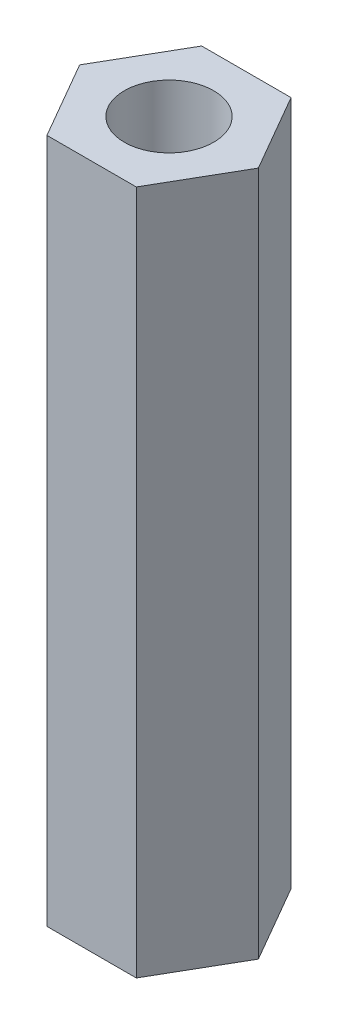
ISO-10303-21;
HEADER;
FILE_DESCRIPTION(('STEP AP214'),'2;1');
FILE_NAME('part.step','',(''),(''),'','','');
FILE_SCHEMA(('AUTOMOTIVE_DESIGN { 1 0 10303 214 1 1 1 1 }'));
ENDSEC;
DATA;
#1=APPLICATION_CONTEXT('core data for automotive mechanical design processes');
#2=APPLICATION_PROTOCOL_DEFINITION('international standard','automotive_design',2000,#1);
#3=PRODUCT_CONTEXT('',#1,'mechanical');
#4=PRODUCT('Part','Part','',(#3));
#5=PRODUCT_RELATED_PRODUCT_CATEGORY('part','',(#4));
#6=PRODUCT_DEFINITION_FORMATION('','',#4);
#7=PRODUCT_DEFINITION_CONTEXT('part definition',#1,'design');
#8=PRODUCT_DEFINITION('design','',#6,#7);
#9=PRODUCT_DEFINITION_SHAPE('','',#8);
#10=(LENGTH_UNIT() NAMED_UNIT(*) SI_UNIT(.MILLI.,.METRE.));
#11=(NAMED_UNIT(*) PLANE_ANGLE_UNIT() SI_UNIT($,.RADIAN.));
#12=(NAMED_UNIT(*) SI_UNIT($,.STERADIAN.) SOLID_ANGLE_UNIT());
#13=UNCERTAINTY_MEASURE_WITH_UNIT(LENGTH_MEASURE(1.E-05),#10,'distance_accuracy_value','');
#14=(GEOMETRIC_REPRESENTATION_CONTEXT(3) GLOBAL_UNCERTAINTY_ASSIGNED_CONTEXT((#13)) GLOBAL_UNIT_ASSIGNED_CONTEXT((#10,
#11,#12)) REPRESENTATION_CONTEXT('',''));
#15=CARTESIAN_POINT('',(0.,0.,0.));
#16=DIRECTION('',(0.,0.,1.));
#17=DIRECTION('',(1.,0.,0.));
#18=AXIS2_PLACEMENT_3D('',#15,#16,#17);
#19=CARTESIAN_POINT('',(1.50000000000003,23.,2.59807621135329));
#20=DIRECTION('',(-0.866025403784441,0.,-0.499999999999995));
#21=DIRECTION('',(-0.499999999999995,0.,0.866025403784442));
#22=AXIS2_PLACEMENT_3D('',#19,#20,#21);
#23=PLANE('',#22);
#24=DIRECTION('',(0.499999999999995,0.,-0.866025403784442));
#25=VECTOR('',#24,1.);
#26=CARTESIAN_POINT('',(1.50000000000003,0.,2.59807621135329));
#27=LINE('',#26,#25);
#28=CARTESIAN_POINT('',(1.50000000000003,0.,2.59807621135329));
#29=VERTEX_POINT('',#28);
#30=CARTESIAN_POINT('',(2.99999999999999,0.,0.));
#31=VERTEX_POINT('',#30);
#32=EDGE_CURVE('E123',#29,#31,#27,.T.);
#33=ORIENTED_EDGE('',*,*,#32,.T.);
#34=DIRECTION('',(0.,-1.,0.));
#35=VECTOR('',#34,1.);
#36=CARTESIAN_POINT('',(2.99999999999999,23.,0.));
#37=LINE('',#36,#35);
#38=CARTESIAN_POINT('',(2.99999999999999,23.,0.));
#39=VERTEX_POINT('',#38);
#40=EDGE_CURVE('E11',#39,#31,#37,.T.);
#41=ORIENTED_EDGE('',*,*,#40,.F.);
#42=DIRECTION('',(0.499999999999995,0.,-0.866025403784442));
#43=VECTOR('',#42,1.);
#44=CARTESIAN_POINT('',(1.50000000000003,23.,2.59807621135329));
#45=LINE('',#44,#43);
#46=CARTESIAN_POINT('',(1.50000000000003,23.,2.59807621135329));
#47=VERTEX_POINT('',#46);
#48=EDGE_CURVE('E134',#47,#39,#45,.T.);
#49=ORIENTED_EDGE('',*,*,#48,.F.);
#50=DIRECTION('',(0.,-1.,0.));
#51=VECTOR('',#50,1.);
#52=CARTESIAN_POINT('',(1.50000000000003,23.,2.59807621135329));
#53=LINE('',#52,#51);
#54=EDGE_CURVE('E119',#47,#29,#53,.T.);
#55=ORIENTED_EDGE('',*,*,#54,.T.);
#56=EDGE_LOOP('',(#33,#41,#49,#55));
#57=FACE_BOUND('',#56,.T.);
#58=ADVANCED_FACE('F39',(#57),#23,.F.);
#59=CARTESIAN_POINT('',(2.99999999999999,23.,0.));
#60=DIRECTION('',(-0.866025403784438,0.,0.500000000000001));
#61=DIRECTION('',(0.500000000000001,0.,0.866025403784438));
#62=AXIS2_PLACEMENT_3D('',#59,#60,#61);
#63=PLANE('',#62);
#64=DIRECTION('',(-0.500000000000001,0.,-0.866025403784438));
#65=VECTOR('',#64,1.);
#66=CARTESIAN_POINT('',(2.99999999999999,0.,0.));
#67=LINE('',#66,#65);
#68=CARTESIAN_POINT('',(1.49999999999999,0.,-2.59807621135331));
#69=VERTEX_POINT('',#68);
#70=EDGE_CURVE('E126',#31,#69,#67,.T.);
#71=ORIENTED_EDGE('',*,*,#70,.T.);
#72=DIRECTION('',(0.,-1.,0.));
#73=VECTOR('',#72,1.);
#74=CARTESIAN_POINT('',(1.49999999999999,23.,-2.59807621135331));
#75=LINE('',#74,#73);
#76=CARTESIAN_POINT('',(1.49999999999999,23.,-2.59807621135331));
#77=VERTEX_POINT('',#76);
#78=EDGE_CURVE('E47',#77,#69,#75,.T.);
#79=ORIENTED_EDGE('',*,*,#78,.F.);
#80=DIRECTION('',(-0.500000000000001,0.,-0.866025403784438));
#81=VECTOR('',#80,1.);
#82=CARTESIAN_POINT('',(2.99999999999999,23.,0.));
#83=LINE('',#82,#81);
#84=EDGE_CURVE('E92',#39,#77,#83,.T.);
#85=ORIENTED_EDGE('',*,*,#84,.F.);
#86=ORIENTED_EDGE('',*,*,#40,.T.);
#87=EDGE_LOOP('',(#71,#79,#85,#86));
#88=FACE_BOUND('',#87,.T.);
#89=ADVANCED_FACE('F159',(#88),#63,.F.);
#90=CARTESIAN_POINT('',(1.49999999999999,23.,-2.59807621135331));
#91=DIRECTION('',(0.,0.,1.));
#92=DIRECTION('',(1.,0.,0.));
#93=AXIS2_PLACEMENT_3D('',#90,#91,#92);
#94=PLANE('',#93);
#95=DIRECTION('',(-1.,0.,0.));
#96=VECTOR('',#95,1.);
#97=CARTESIAN_POINT('',(1.49999999999999,0.,-2.59807621135331));
#98=LINE('',#97,#96);
#99=CARTESIAN_POINT('',(-1.50000000000001,0.,-2.5980762113533));
#100=VERTEX_POINT('',#99);
#101=EDGE_CURVE('E129',#69,#100,#98,.T.);
#102=ORIENTED_EDGE('',*,*,#101,.T.);
#103=DIRECTION('',(0.,-1.,0.));
#104=VECTOR('',#103,1.);
#105=CARTESIAN_POINT('',(-1.50000000000001,23.,-2.5980762113533));
#106=LINE('',#105,#104);
#107=CARTESIAN_POINT('',(-1.50000000000001,23.,-2.5980762113533));
#108=VERTEX_POINT('',#107);
#109=EDGE_CURVE('E114',#108,#100,#106,.T.);
#110=ORIENTED_EDGE('',*,*,#109,.F.);
#111=DIRECTION('',(-1.,0.,0.));
#112=VECTOR('',#111,1.);
#113=CARTESIAN_POINT('',(1.49999999999999,23.,-2.59807621135331));
#114=LINE('',#113,#112);
#115=EDGE_CURVE('E105',#77,#108,#114,.T.);
#116=ORIENTED_EDGE('',*,*,#115,.F.);
#117=ORIENTED_EDGE('',*,*,#78,.T.);
#118=EDGE_LOOP('',(#102,#110,#116,#117));
#119=FACE_BOUND('',#118,.T.);
#120=ADVANCED_FACE('F140',(#119),#94,.F.);
#121=CARTESIAN_POINT('',(-1.50000000000001,23.,-2.5980762113533));
#122=DIRECTION('',(0.866025403784442,0.,0.499999999999995));
#123=DIRECTION('',(0.499999999999995,0.,-0.866025403784442));
#124=AXIS2_PLACEMENT_3D('',#121,#122,#123);
#125=PLANE('',#124);
#126=DIRECTION('',(-0.499999999999995,0.,0.866025403784442));
#127=VECTOR('',#126,1.);
#128=CARTESIAN_POINT('',(-1.50000000000001,0.,-2.5980762113533));
#129=LINE('',#128,#127);
#130=CARTESIAN_POINT('',(-2.99999999999999,0.,0.));
#131=VERTEX_POINT('',#130);
#132=EDGE_CURVE('E113',#100,#131,#129,.T.);
#133=ORIENTED_EDGE('',*,*,#132,.T.);
#134=DIRECTION('',(0.,-1.,0.));
#135=VECTOR('',#134,1.);
#136=CARTESIAN_POINT('',(-2.99999999999999,23.,0.));
#137=LINE('',#136,#135);
#138=CARTESIAN_POINT('',(-2.99999999999999,23.,0.));
#139=VERTEX_POINT('',#138);
#140=EDGE_CURVE('E110',#139,#131,#137,.T.);
#141=ORIENTED_EDGE('',*,*,#140,.F.);
#142=DIRECTION('',(-0.499999999999995,0.,0.866025403784442));
#143=VECTOR('',#142,1.);
#144=CARTESIAN_POINT('',(-1.50000000000001,23.,-2.5980762113533));
#145=LINE('',#144,#143);
#146=EDGE_CURVE('E99',#108,#139,#145,.T.);
#147=ORIENTED_EDGE('',*,*,#146,.F.);
#148=ORIENTED_EDGE('',*,*,#109,.T.);
#149=EDGE_LOOP('',(#133,#141,#147,#148));
#150=FACE_BOUND('',#149,.T.);
#151=ADVANCED_FACE('F111',(#150),#125,.F.);
#152=CARTESIAN_POINT('',(-2.99999999999999,23.,0.));
#153=DIRECTION('',(0.866025403784435,0.,-0.500000000000007));
#154=DIRECTION('',(-0.500000000000007,0.,-0.866025403784435));
#155=AXIS2_PLACEMENT_3D('',#152,#153,#154);
#156=PLANE('',#155);
#157=DIRECTION('',(0.500000000000007,0.,0.866025403784435));
#158=VECTOR('',#157,1.);
#159=CARTESIAN_POINT('',(-2.99999999999999,0.,0.));
#160=LINE('',#159,#158);
#161=CARTESIAN_POINT('',(-1.49999999999997,0.,2.59807621135332));
#162=VERTEX_POINT('',#161);
#163=EDGE_CURVE('E78',#131,#162,#160,.T.);
#164=ORIENTED_EDGE('',*,*,#163,.T.);
#165=DIRECTION('',(0.,-1.,0.));
#166=VECTOR('',#165,1.);
#167=CARTESIAN_POINT('',(-1.49999999999997,23.,2.59807621135332));
#168=LINE('',#167,#166);
#169=CARTESIAN_POINT('',(-1.49999999999997,23.,2.59807621135332));
#170=VERTEX_POINT('',#169);
#171=EDGE_CURVE('E115',#170,#162,#168,.T.);
#172=ORIENTED_EDGE('',*,*,#171,.F.);
#173=DIRECTION('',(0.500000000000007,0.,0.866025403784435));
#174=VECTOR('',#173,1.);
#175=CARTESIAN_POINT('',(-2.99999999999999,23.,0.));
#176=LINE('',#175,#174);
#177=EDGE_CURVE('E103',#139,#170,#176,.T.);
#178=ORIENTED_EDGE('',*,*,#177,.F.);
#179=ORIENTED_EDGE('',*,*,#140,.T.);
#180=EDGE_LOOP('',(#164,#172,#178,#179));
#181=FACE_BOUND('',#180,.T.);
#182=ADVANCED_FACE('F117',(#181),#156,.F.);
#183=CARTESIAN_POINT('',(-1.49999999999997,23.,2.59807621135332));
#184=DIRECTION('',(0.,0.,-1.));
#185=DIRECTION('',(-1.,0.,0.));
#186=AXIS2_PLACEMENT_3D('',#183,#184,#185);
#187=PLANE('',#186);
#188=DIRECTION('',(1.,0.,0.));
#189=VECTOR('',#188,1.);
#190=CARTESIAN_POINT('',(-1.49999999999997,0.,2.59807621135332));
#191=LINE('',#190,#189);
#192=EDGE_CURVE('E84',#162,#29,#191,.T.);
#193=ORIENTED_EDGE('',*,*,#192,.T.);
#194=ORIENTED_EDGE('',*,*,#54,.F.);
#195=DIRECTION('',(1.,0.,0.));
#196=VECTOR('',#195,1.);
#197=CARTESIAN_POINT('',(-1.49999999999997,23.,2.59807621135332));
#198=LINE('',#197,#196);
#199=EDGE_CURVE('E55',#170,#47,#198,.T.);
#200=ORIENTED_EDGE('',*,*,#199,.F.);
#201=ORIENTED_EDGE('',*,*,#171,.T.);
#202=EDGE_LOOP('',(#193,#194,#200,#201));
#203=FACE_BOUND('',#202,.T.);
#204=ADVANCED_FACE('F147',(#203),#187,.F.);
#205=CARTESIAN_POINT('',(0.,23.,0.));
#206=DIRECTION('',(0.,1.,0.));
#207=DIRECTION('',(0.,0.,1.));
#208=AXIS2_PLACEMENT_3D('',#205,#206,#207);
#209=PLANE('',#208);
#210=CARTESIAN_POINT('',(0.,23.,0.));
#211=DIRECTION('',(0.,1.,0.));
#212=DIRECTION('',(0.,0.,1.));
#213=AXIS2_PLACEMENT_3D('',#210,#211,#212);
#214=CIRCLE('',#213,1.5);
#215=CARTESIAN_POINT('',(0.,23.,1.5));
#216=VERTEX_POINT('',#215);
#217=EDGE_CURVE('E215',#216,#216,#214,.T.);
#218=ORIENTED_EDGE('',*,*,#217,.F.);
#219=EDGE_LOOP('',(#218));
#220=FACE_BOUND('',#219,.T.);
#221=ORIENTED_EDGE('',*,*,#48,.T.);
#222=ORIENTED_EDGE('',*,*,#84,.T.);
#223=ORIENTED_EDGE('',*,*,#115,.T.);
#224=ORIENTED_EDGE('',*,*,#146,.T.);
#225=ORIENTED_EDGE('',*,*,#177,.T.);
#226=ORIENTED_EDGE('',*,*,#199,.T.);
#227=EDGE_LOOP('',(#221,#222,#223,#224,#225,#226));
#228=FACE_BOUND('',#227,.T.);
#229=ADVANCED_FACE('F101',(#220,#228),#209,.T.);
#230=CARTESIAN_POINT('',(0.,0.,0.));
#231=DIRECTION('',(0.,1.,0.));
#232=DIRECTION('',(0.,0.,1.));
#233=AXIS2_PLACEMENT_3D('',#230,#231,#232);
#234=PLANE('',#233);
#235=CARTESIAN_POINT('',(0.,0.,0.));
#236=DIRECTION('',(0.,1.,0.));
#237=DIRECTION('',(0.,0.,1.));
#238=AXIS2_PLACEMENT_3D('',#235,#236,#237);
#239=CIRCLE('',#238,1.5);
#240=CARTESIAN_POINT('',(0.,0.,1.5));
#241=VERTEX_POINT('',#240);
#242=EDGE_CURVE('E127',#241,#241,#239,.T.);
#243=ORIENTED_EDGE('',*,*,#242,.T.);
#244=EDGE_LOOP('',(#243));
#245=FACE_BOUND('',#244,.T.);
#246=ORIENTED_EDGE('',*,*,#32,.F.);
#247=ORIENTED_EDGE('',*,*,#192,.F.);
#248=ORIENTED_EDGE('',*,*,#163,.F.);
#249=ORIENTED_EDGE('',*,*,#132,.F.);
#250=ORIENTED_EDGE('',*,*,#101,.F.);
#251=ORIENTED_EDGE('',*,*,#70,.F.);
#252=EDGE_LOOP('',(#246,#247,#248,#249,#250,#251));
#253=FACE_BOUND('',#252,.T.);
#254=ADVANCED_FACE('F143',(#245,#253),#234,.F.);
#255=CARTESIAN_POINT('',(0.,0.,0.));
#256=DIRECTION('',(0.,1.,0.));
#257=DIRECTION('',(0.,0.,1.));
#258=AXIS2_PLACEMENT_3D('',#255,#256,#257);
#259=CYLINDRICAL_SURFACE('',#258,1.5);
#260=ORIENTED_EDGE('',*,*,#242,.F.);
#261=EDGE_LOOP('',(#260));
#262=FACE_BOUND('',#261,.T.);
#263=ORIENTED_EDGE('',*,*,#217,.T.);
#264=EDGE_LOOP('',(#263));
#265=FACE_BOUND('',#264,.T.);
#266=ADVANCED_FACE('F198',(#262,#265),#259,.F.);
#267=CLOSED_SHELL('',(#58,#89,#120,#151,#182,#204,#229,#254,#266));
#268=MANIFOLD_SOLID_BREP('B2',#267);
#269=ADVANCED_BREP_SHAPE_REPRESENTATION('',(#18,#268),#14);
#270=SHAPE_DEFINITION_REPRESENTATION(#9,#269);
ENDSEC;
END-ISO-10303-21;
